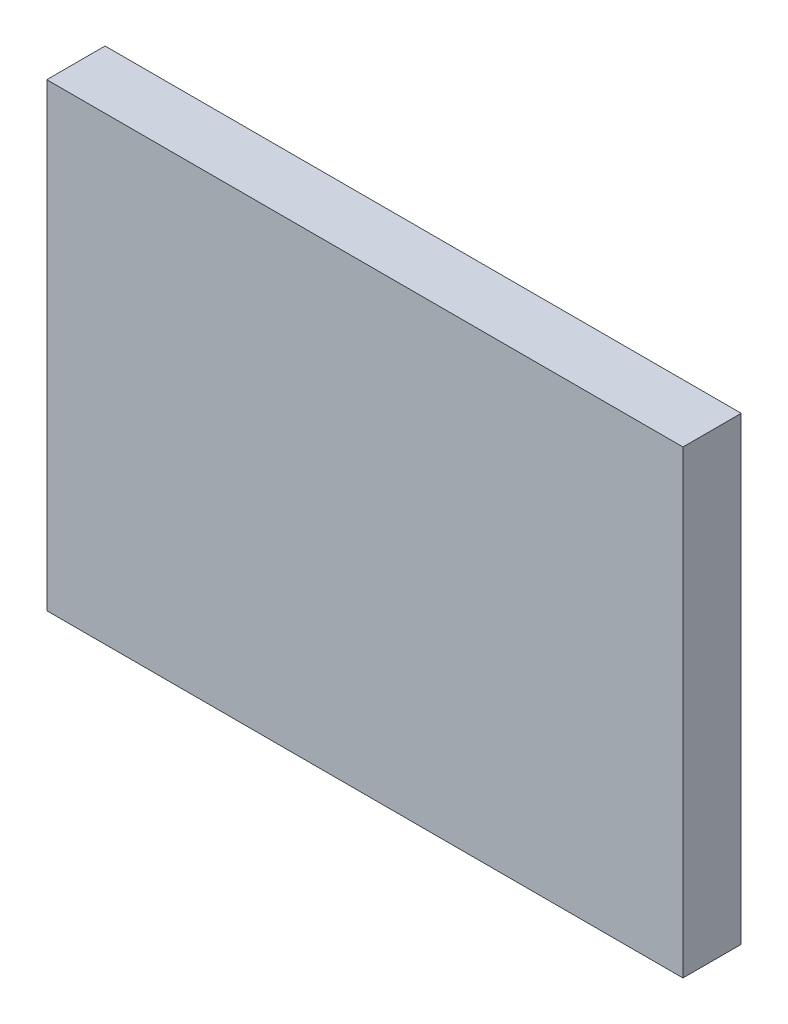
ISO-10303-21;
HEADER;
FILE_DESCRIPTION(('STEP AP214'),'2;1');
FILE_NAME('part.step','',(''),(''),'','','');
FILE_SCHEMA(('AUTOMOTIVE_DESIGN { 1 0 10303 214 1 1 1 1 }'));
ENDSEC;
DATA;
#1=APPLICATION_CONTEXT('core data for automotive mechanical design processes');
#2=APPLICATION_PROTOCOL_DEFINITION('international standard','automotive_design',2000,#1);
#3=PRODUCT_CONTEXT('',#1,'mechanical');
#4=PRODUCT('Part','Part','',(#3));
#5=PRODUCT_RELATED_PRODUCT_CATEGORY('part','',(#4));
#6=PRODUCT_DEFINITION_FORMATION('','',#4);
#7=PRODUCT_DEFINITION_CONTEXT('part definition',#1,'design');
#8=PRODUCT_DEFINITION('design','',#6,#7);
#9=PRODUCT_DEFINITION_SHAPE('','',#8);
#10=(LENGTH_UNIT() NAMED_UNIT(*) SI_UNIT(.MILLI.,.METRE.));
#11=(NAMED_UNIT(*) PLANE_ANGLE_UNIT() SI_UNIT($,.RADIAN.));
#12=(NAMED_UNIT(*) SI_UNIT($,.STERADIAN.) SOLID_ANGLE_UNIT());
#13=UNCERTAINTY_MEASURE_WITH_UNIT(LENGTH_MEASURE(1.E-05),#10,'distance_accuracy_value','');
#14=(GEOMETRIC_REPRESENTATION_CONTEXT(3) GLOBAL_UNCERTAINTY_ASSIGNED_CONTEXT((#13)) GLOBAL_UNIT_ASSIGNED_CONTEXT((#10,
#11,#12)) REPRESENTATION_CONTEXT('',''));
#15=CARTESIAN_POINT('',(0.,0.,0.));
#16=DIRECTION('',(0.,0.,1.));
#17=DIRECTION('',(1.,0.,0.));
#18=AXIS2_PLACEMENT_3D('',#15,#16,#17);
#19=CARTESIAN_POINT('',(6.912,3.888,1.));
#20=DIRECTION('',(0.,-1.,0.));
#21=DIRECTION('',(1.,0.,0.));
#22=AXIS2_PLACEMENT_3D('',#19,#20,#21);
#23=PLANE('',#22);
#24=DIRECTION('',(-1.,0.,0.));
#25=VECTOR('',#24,1.);
#26=CARTESIAN_POINT('',(6.912,3.888,0.));
#27=LINE('',#26,#25);
#28=CARTESIAN_POINT('',(6.912,3.888,0.));
#29=VERTEX_POINT('',#28);
#30=CARTESIAN_POINT('',(0.,3.888,0.));
#31=VERTEX_POINT('',#30);
#32=EDGE_CURVE('E201',#29,#31,#27,.T.);
#33=ORIENTED_EDGE('',*,*,#32,.T.);
#34=DIRECTION('',(0.,0.,-1.));
#35=VECTOR('',#34,1.);
#36=CARTESIAN_POINT('',(0.,3.888,1.));
#37=LINE('',#36,#35);
#38=CARTESIAN_POINT('',(0.,3.888,1.));
#39=VERTEX_POINT('',#38);
#40=EDGE_CURVE('E11',#39,#31,#37,.T.);
#41=ORIENTED_EDGE('',*,*,#40,.F.);
#42=DIRECTION('',(-1.,0.,0.));
#43=VECTOR('',#42,1.);
#44=CARTESIAN_POINT('',(6.912,3.888,1.));
#45=LINE('',#44,#43);
#46=CARTESIAN_POINT('',(6.912,3.888,1.));
#47=VERTEX_POINT('',#46);
#48=EDGE_CURVE('E202',#47,#39,#45,.T.);
#49=ORIENTED_EDGE('',*,*,#48,.F.);
#50=DIRECTION('',(0.,0.,-1.));
#51=VECTOR('',#50,1.);
#52=CARTESIAN_POINT('',(6.912,3.888,1.));
#53=LINE('',#52,#51);
#54=EDGE_CURVE('E212',#47,#29,#53,.T.);
#55=ORIENTED_EDGE('',*,*,#54,.T.);
#56=EDGE_LOOP('',(#33,#41,#49,#55));
#57=FACE_BOUND('',#56,.T.);
#58=ADVANCED_FACE('F36',(#57),#23,.F.);
#59=CARTESIAN_POINT('',(0.,0.,1.));
#60=DIRECTION('',(-1.,0.,0.));
#61=DIRECTION('',(0.,-1.,0.));
#62=AXIS2_PLACEMENT_3D('',#59,#60,#61);
#63=PLANE('',#62);
#64=DIRECTION('',(0.,1.,0.));
#65=VECTOR('',#64,1.);
#66=CARTESIAN_POINT('',(0.,0.,0.));
#67=LINE('',#66,#65);
#68=CARTESIAN_POINT('',(0.,0.,0.));
#69=VERTEX_POINT('',#68);
#70=EDGE_CURVE('E214',#69,#31,#67,.T.);
#71=ORIENTED_EDGE('',*,*,#70,.F.);
#72=DIRECTION('',(0.,0.,-1.));
#73=VECTOR('',#72,1.);
#74=CARTESIAN_POINT('',(0.,0.,1.));
#75=LINE('',#74,#73);
#76=CARTESIAN_POINT('',(0.,0.,1.));
#77=VERTEX_POINT('',#76);
#78=EDGE_CURVE('E43',#77,#69,#75,.T.);
#79=ORIENTED_EDGE('',*,*,#78,.F.);
#80=DIRECTION('',(0.,1.,0.));
#81=VECTOR('',#80,1.);
#82=CARTESIAN_POINT('',(0.,0.,1.));
#83=LINE('',#82,#81);
#84=EDGE_CURVE('E205',#77,#39,#83,.T.);
#85=ORIENTED_EDGE('',*,*,#84,.T.);
#86=ORIENTED_EDGE('',*,*,#40,.T.);
#87=EDGE_LOOP('',(#71,#79,#85,#86));
#88=FACE_BOUND('',#87,.T.);
#89=ADVANCED_FACE('F227',(#88),#63,.T.);
#90=CARTESIAN_POINT('',(6.912,0.,1.));
#91=DIRECTION('',(0.,-1.,0.));
#92=DIRECTION('',(0.,0.,-1.));
#93=AXIS2_PLACEMENT_3D('',#90,#91,#92);
#94=PLANE('',#93);
#95=DIRECTION('',(-1.,0.,0.));
#96=VECTOR('',#95,1.);
#97=CARTESIAN_POINT('',(6.912,0.,0.));
#98=LINE('',#97,#96);
#99=CARTESIAN_POINT('',(6.912,0.,0.));
#100=VERTEX_POINT('',#99);
#101=EDGE_CURVE('E217',#100,#69,#98,.T.);
#102=ORIENTED_EDGE('',*,*,#101,.F.);
#103=DIRECTION('',(0.,0.,-1.));
#104=VECTOR('',#103,1.);
#105=CARTESIAN_POINT('',(6.912,0.,1.));
#106=LINE('',#105,#104);
#107=CARTESIAN_POINT('',(6.912,0.,1.));
#108=VERTEX_POINT('',#107);
#109=EDGE_CURVE('E59',#108,#100,#106,.T.);
#110=ORIENTED_EDGE('',*,*,#109,.F.);
#111=DIRECTION('',(-1.,0.,0.));
#112=VECTOR('',#111,1.);
#113=CARTESIAN_POINT('',(6.912,0.,1.));
#114=LINE('',#113,#112);
#115=EDGE_CURVE('E207',#108,#77,#114,.T.);
#116=ORIENTED_EDGE('',*,*,#115,.T.);
#117=ORIENTED_EDGE('',*,*,#78,.T.);
#118=EDGE_LOOP('',(#102,#110,#116,#117));
#119=FACE_BOUND('',#118,.T.);
#120=ADVANCED_FACE('F223',(#119),#94,.T.);
#121=CARTESIAN_POINT('',(6.912,0.,1.));
#122=DIRECTION('',(-1.,0.,0.));
#123=DIRECTION('',(0.,0.,1.));
#124=AXIS2_PLACEMENT_3D('',#121,#122,#123);
#125=PLANE('',#124);
#126=DIRECTION('',(0.,1.,0.));
#127=VECTOR('',#126,1.);
#128=CARTESIAN_POINT('',(6.912,0.,0.));
#129=LINE('',#128,#127);
#130=EDGE_CURVE('E78',#100,#29,#129,.T.);
#131=ORIENTED_EDGE('',*,*,#130,.T.);
#132=ORIENTED_EDGE('',*,*,#54,.F.);
#133=DIRECTION('',(0.,1.,0.));
#134=VECTOR('',#133,1.);
#135=CARTESIAN_POINT('',(6.912,0.,1.));
#136=LINE('',#135,#134);
#137=EDGE_CURVE('E209',#108,#47,#136,.T.);
#138=ORIENTED_EDGE('',*,*,#137,.F.);
#139=ORIENTED_EDGE('',*,*,#109,.T.);
#140=EDGE_LOOP('',(#131,#132,#138,#139));
#141=FACE_BOUND('',#140,.T.);
#142=ADVANCED_FACE('F231',(#141),#125,.F.);
#143=CARTESIAN_POINT('',(0.,0.,0.));
#144=DIRECTION('',(0.,0.,-1.));
#145=DIRECTION('',(-1.,0.,0.));
#146=AXIS2_PLACEMENT_3D('',#143,#144,#145);
#147=PLANE('',#146);
#148=DIRECTION('',(-0.707106781186548,-0.707106781186547,0.));
#149=VECTOR('',#148,1.);
#150=CARTESIAN_POINT('',(3.456,2.444,0.));
#151=LINE('',#150,#149);
#152=CARTESIAN_POINT('',(3.456,2.444,0.));
#153=VERTEX_POINT('',#152);
#154=CARTESIAN_POINT('',(2.96106125524031,1.94906125524031,0.));
#155=VERTEX_POINT('',#154);
#156=EDGE_CURVE('E369',#153,#155,#151,.T.);
#157=ORIENTED_EDGE('',*,*,#156,.T.);
#158=DIRECTION('',(-0.707106781186547,0.707106781186547,0.));
#159=VECTOR('',#158,1.);
#160=CARTESIAN_POINT('',(3.46106125524031,1.44906125524031,0.));
#161=LINE('',#160,#159);
#162=CARTESIAN_POINT('',(3.46106125524031,1.44906125524031,0.));
#163=VERTEX_POINT('',#162);
#164=EDGE_CURVE('E379',#163,#155,#161,.T.);
#165=ORIENTED_EDGE('',*,*,#164,.F.);
#166=DIRECTION('',(-0.707106781186548,-0.707106781186547,0.));
#167=VECTOR('',#166,1.);
#168=CARTESIAN_POINT('',(3.956,1.944,0.));
#169=LINE('',#168,#167);
#170=CARTESIAN_POINT('',(3.956,1.944,0.));
#171=VERTEX_POINT('',#170);
#172=EDGE_CURVE('E381',#171,#163,#169,.T.);
#173=ORIENTED_EDGE('',*,*,#172,.F.);
#174=DIRECTION('',(-0.707106781186547,0.707106781186547,0.));
#175=VECTOR('',#174,1.);
#176=CARTESIAN_POINT('',(3.956,1.944,0.));
#177=LINE('',#176,#175);
#178=EDGE_CURVE('E162',#171,#153,#177,.T.);
#179=ORIENTED_EDGE('',*,*,#178,.T.);
#180=EDGE_LOOP('',(#157,#165,#173,#179));
#181=FACE_BOUND('',#180,.T.);
#182=ORIENTED_EDGE('',*,*,#32,.F.);
#183=ORIENTED_EDGE('',*,*,#130,.F.);
#184=ORIENTED_EDGE('',*,*,#101,.T.);
#185=ORIENTED_EDGE('',*,*,#70,.T.);
#186=EDGE_LOOP('',(#182,#183,#184,#185));
#187=FACE_BOUND('',#186,.T.);
#188=ADVANCED_FACE('F230',(#181,#187),#147,.T.);
#189=CARTESIAN_POINT('',(-2.,-2.,2.));
#190=DIRECTION('',(0.,1.,0.));
#191=DIRECTION('',(0.,0.,1.));
#192=AXIS2_PLACEMENT_3D('',#189,#190,#191);
#193=PLANE('',#192);
#194=DIRECTION('',(1.,0.,0.));
#195=VECTOR('',#194,1.);
#196=CARTESIAN_POINT('',(-2.,-2.,1.));
#197=LINE('',#196,#195);
#198=CARTESIAN_POINT('',(-2.,-2.,1.));
#199=VERTEX_POINT('',#198);
#200=CARTESIAN_POINT('',(8.912,-2.,1.));
#201=VERTEX_POINT('',#200);
#202=EDGE_CURVE('E166',#199,#201,#197,.T.);
#203=ORIENTED_EDGE('',*,*,#202,.T.);
#204=DIRECTION('',(0.,0.,-1.));
#205=VECTOR('',#204,1.);
#206=CARTESIAN_POINT('',(8.912,-2.,2.));
#207=LINE('',#206,#205);
#208=CARTESIAN_POINT('',(8.912,-2.,2.));
#209=VERTEX_POINT('',#208);
#210=EDGE_CURVE('E199',#209,#201,#207,.T.);
#211=ORIENTED_EDGE('',*,*,#210,.F.);
#212=DIRECTION('',(1.,0.,0.));
#213=VECTOR('',#212,1.);
#214=CARTESIAN_POINT('',(-2.,-2.,2.));
#215=LINE('',#214,#213);
#216=CARTESIAN_POINT('',(-2.,-2.,2.));
#217=VERTEX_POINT('',#216);
#218=EDGE_CURVE('E172',#217,#209,#215,.T.);
#219=ORIENTED_EDGE('',*,*,#218,.F.);
#220=DIRECTION('',(0.,0.,-1.));
#221=VECTOR('',#220,1.);
#222=CARTESIAN_POINT('',(-2.,-2.,2.));
#223=LINE('',#222,#221);
#224=EDGE_CURVE('E183',#217,#199,#223,.T.);
#225=ORIENTED_EDGE('',*,*,#224,.T.);
#226=EDGE_LOOP('',(#203,#211,#219,#225));
#227=FACE_BOUND('',#226,.T.);
#228=ADVANCED_FACE('F245',(#227),#193,.F.);
#229=CARTESIAN_POINT('',(8.912,5.888,2.));
#230=DIRECTION('',(1.,0.,0.));
#231=DIRECTION('',(0.,0.,-1.));
#232=AXIS2_PLACEMENT_3D('',#229,#230,#231);
#233=PLANE('',#232);
#234=DIRECTION('',(0.,-1.,0.));
#235=VECTOR('',#234,1.);
#236=CARTESIAN_POINT('',(8.912,5.888,1.));
#237=LINE('',#236,#235);
#238=CARTESIAN_POINT('',(8.912,5.888,1.));
#239=VERTEX_POINT('',#238);
#240=EDGE_CURVE('E186',#239,#201,#237,.T.);
#241=ORIENTED_EDGE('',*,*,#240,.F.);
#242=DIRECTION('',(0.,0.,-1.));
#243=VECTOR('',#242,1.);
#244=CARTESIAN_POINT('',(8.912,5.888,2.));
#245=LINE('',#244,#243);
#246=CARTESIAN_POINT('',(8.912,5.888,2.));
#247=VERTEX_POINT('',#246);
#248=EDGE_CURVE('E197',#247,#239,#245,.T.);
#249=ORIENTED_EDGE('',*,*,#248,.F.);
#250=DIRECTION('',(0.,-1.,0.));
#251=VECTOR('',#250,1.);
#252=CARTESIAN_POINT('',(8.912,5.888,2.));
#253=LINE('',#252,#251);
#254=EDGE_CURVE('E174',#247,#209,#253,.T.);
#255=ORIENTED_EDGE('',*,*,#254,.T.);
#256=ORIENTED_EDGE('',*,*,#210,.T.);
#257=EDGE_LOOP('',(#241,#249,#255,#256));
#258=FACE_BOUND('',#257,.T.);
#259=ADVANCED_FACE('F256',(#258),#233,.T.);
#260=CARTESIAN_POINT('',(-2.,5.888,2.));
#261=DIRECTION('',(0.,1.,0.));
#262=DIRECTION('',(0.,0.,1.));
#263=AXIS2_PLACEMENT_3D('',#260,#261,#262);
#264=PLANE('',#263);
#265=DIRECTION('',(1.,0.,0.));
#266=VECTOR('',#265,1.);
#267=CARTESIAN_POINT('',(-2.,5.888,1.));
#268=LINE('',#267,#266);
#269=CARTESIAN_POINT('',(-2.,5.888,1.));
#270=VERTEX_POINT('',#269);
#271=EDGE_CURVE('E189',#270,#239,#268,.T.);
#272=ORIENTED_EDGE('',*,*,#271,.F.);
#273=DIRECTION('',(0.,0.,-1.));
#274=VECTOR('',#273,1.);
#275=CARTESIAN_POINT('',(-2.,5.888,2.));
#276=LINE('',#275,#274);
#277=CARTESIAN_POINT('',(-2.,5.888,2.));
#278=VERTEX_POINT('',#277);
#279=EDGE_CURVE('E195',#278,#270,#276,.T.);
#280=ORIENTED_EDGE('',*,*,#279,.F.);
#281=DIRECTION('',(1.,0.,0.));
#282=VECTOR('',#281,1.);
#283=CARTESIAN_POINT('',(-2.,5.888,2.));
#284=LINE('',#283,#282);
#285=EDGE_CURVE('E178',#278,#247,#284,.T.);
#286=ORIENTED_EDGE('',*,*,#285,.T.);
#287=ORIENTED_EDGE('',*,*,#248,.T.);
#288=EDGE_LOOP('',(#272,#280,#286,#287));
#289=FACE_BOUND('',#288,.T.);
#290=ADVANCED_FACE('F253',(#289),#264,.T.);
#291=CARTESIAN_POINT('',(-2.,5.888,2.));
#292=DIRECTION('',(1.,0.,0.));
#293=DIRECTION('',(0.,1.,0.));
#294=AXIS2_PLACEMENT_3D('',#291,#292,#293);
#295=PLANE('',#294);
#296=DIRECTION('',(0.,-1.,0.));
#297=VECTOR('',#296,1.);
#298=CARTESIAN_POINT('',(-2.,5.888,1.));
#299=LINE('',#298,#297);
#300=EDGE_CURVE('E175',#270,#199,#299,.T.);
#301=ORIENTED_EDGE('',*,*,#300,.T.);
#302=ORIENTED_EDGE('',*,*,#224,.F.);
#303=DIRECTION('',(0.,-1.,0.));
#304=VECTOR('',#303,1.);
#305=CARTESIAN_POINT('',(-2.,5.888,2.));
#306=LINE('',#305,#304);
#307=EDGE_CURVE('E181',#278,#217,#306,.T.);
#308=ORIENTED_EDGE('',*,*,#307,.F.);
#309=ORIENTED_EDGE('',*,*,#279,.T.);
#310=EDGE_LOOP('',(#301,#302,#308,#309));
#311=FACE_BOUND('',#310,.T.);
#312=ADVANCED_FACE('F250',(#311),#295,.F.);
#313=CARTESIAN_POINT('',(0.,0.,2.));
#314=DIRECTION('',(0.,0.,-1.));
#315=DIRECTION('',(-1.,0.,0.));
#316=AXIS2_PLACEMENT_3D('',#313,#314,#315);
#317=PLANE('',#316);
#318=ORIENTED_EDGE('',*,*,#218,.T.);
#319=ORIENTED_EDGE('',*,*,#254,.F.);
#320=ORIENTED_EDGE('',*,*,#285,.F.);
#321=ORIENTED_EDGE('',*,*,#307,.T.);
#322=EDGE_LOOP('',(#318,#319,#320,#321));
#323=FACE_BOUND('',#322,.T.);
#324=ADVANCED_FACE('F237',(#323),#317,.F.);
#325=CARTESIAN_POINT('',(0.,0.,1.));
#326=DIRECTION('',(0.,0.,-1.));
#327=DIRECTION('',(-1.,0.,0.));
#328=AXIS2_PLACEMENT_3D('',#325,#326,#327);
#329=PLANE('',#328);
#330=ORIENTED_EDGE('',*,*,#137,.T.);
#331=ORIENTED_EDGE('',*,*,#48,.T.);
#332=ORIENTED_EDGE('',*,*,#84,.F.);
#333=ORIENTED_EDGE('',*,*,#115,.F.);
#334=EDGE_LOOP('',(#330,#331,#332,#333));
#335=FACE_BOUND('',#334,.T.);
#336=ORIENTED_EDGE('',*,*,#202,.F.);
#337=ORIENTED_EDGE('',*,*,#300,.F.);
#338=ORIENTED_EDGE('',*,*,#271,.T.);
#339=ORIENTED_EDGE('',*,*,#240,.T.);
#340=EDGE_LOOP('',(#336,#337,#338,#339));
#341=FACE_BOUND('',#340,.T.);
#342=ADVANCED_FACE('F233',(#335,#341),#329,.T.);
#343=CARTESIAN_POINT('',(3.456,2.444,-0.48));
#344=DIRECTION('',(-0.707106781186547,0.707106781186548,0.));
#345=DIRECTION('',(-0.707106781186548,-0.707106781186547,0.));
#346=AXIS2_PLACEMENT_3D('',#343,#344,#345);
#347=PLANE('',#346);
#348=DIRECTION('',(0.583157796849037,0.583157796849036,0.565556334902506));
#349=VECTOR('',#348,1.);
#350=CARTESIAN_POINT('',(3.29769187859723,2.28569187859723,-0.153529904615212));
#351=LINE('',#350,#349);
#352=CARTESIAN_POINT('',(2.96106125524031,1.94906125524031,-0.48));
#353=VERTEX_POINT('',#352);
#354=CARTESIAN_POINT('',(3.20853062762016,2.19653062762015,-0.24));
#355=VERTEX_POINT('',#354);
#356=EDGE_CURVE('E366',#353,#355,#351,.T.);
#357=ORIENTED_EDGE('',*,*,#356,.F.);
#358=DIRECTION('',(0.,0.,1.));
#359=VECTOR('',#358,1.);
#360=CARTESIAN_POINT('',(2.96106125524031,1.94906125524031,-0.48));
#361=LINE('',#360,#359);
#362=EDGE_CURVE('E151',#353,#155,#361,.T.);
#363=ORIENTED_EDGE('',*,*,#362,.T.);
#364=ORIENTED_EDGE('',*,*,#156,.F.);
#365=DIRECTION('',(0.,0.,1.));
#366=VECTOR('',#365,1.);
#367=CARTESIAN_POINT('',(3.456,2.444,-0.48));
#368=LINE('',#367,#366);
#369=CARTESIAN_POINT('',(3.456,2.444,-0.48));
#370=VERTEX_POINT('',#369);
#371=EDGE_CURVE('E164',#370,#153,#368,.T.);
#372=ORIENTED_EDGE('',*,*,#371,.F.);
#373=DIRECTION('',(0.583157796849037,0.583157796849036,-0.565556334902506));
#374=VECTOR('',#373,1.);
#375=CARTESIAN_POINT('',(3.456,2.444,-0.479999999999999));
#376=LINE('',#375,#374);
#377=EDGE_CURVE('E147',#355,#370,#376,.T.);
#378=ORIENTED_EDGE('',*,*,#377,.F.);
#379=EDGE_LOOP('',(#357,#363,#364,#372,#378));
#380=FACE_BOUND('',#379,.T.);
#381=ADVANCED_FACE('F236',(#380),#347,.T.);
#382=CARTESIAN_POINT('',(3.956,1.944,-0.48));
#383=DIRECTION('',(0.707106781186548,0.707106781186548,0.));
#384=DIRECTION('',(-0.707106781186548,0.707106781186548,0.));
#385=AXIS2_PLACEMENT_3D('',#382,#383,#384);
#386=PLANE('',#385);
#387=ORIENTED_EDGE('',*,*,#178,.F.);
#388=DIRECTION('',(0.,0.,1.));
#389=VECTOR('',#388,1.);
#390=CARTESIAN_POINT('',(3.956,1.944,-0.48));
#391=LINE('',#390,#389);
#392=CARTESIAN_POINT('',(3.956,1.944,-0.48));
#393=VERTEX_POINT('',#392);
#394=EDGE_CURVE('E156',#393,#171,#391,.T.);
#395=ORIENTED_EDGE('',*,*,#394,.F.);
#396=DIRECTION('',(-0.707106781186547,0.707106781186547,0.));
#397=VECTOR('',#396,1.);
#398=CARTESIAN_POINT('',(3.956,1.944,-0.48));
#399=LINE('',#398,#397);
#400=EDGE_CURVE('E140',#393,#370,#399,.T.);
#401=ORIENTED_EDGE('',*,*,#400,.T.);
#402=ORIENTED_EDGE('',*,*,#371,.T.);
#403=EDGE_LOOP('',(#387,#395,#401,#402));
#404=FACE_BOUND('',#403,.T.);
#405=ADVANCED_FACE('F160',(#404),#386,.T.);
#406=CARTESIAN_POINT('',(3.956,1.944,-0.48));
#407=DIRECTION('',(-0.707106781186547,0.707106781186548,0.));
#408=DIRECTION('',(-0.707106781186548,-0.707106781186547,0.));
#409=AXIS2_PLACEMENT_3D('',#406,#407,#408);
#410=PLANE('',#409);
#411=DIRECTION('',(0.,0.,1.));
#412=VECTOR('',#411,1.);
#413=CARTESIAN_POINT('',(3.46106125524031,1.44906125524031,-0.48));
#414=LINE('',#413,#412);
#415=CARTESIAN_POINT('',(3.46106125524031,1.44906125524031,-0.48));
#416=VERTEX_POINT('',#415);
#417=EDGE_CURVE('E50',#416,#163,#414,.T.);
#418=ORIENTED_EDGE('',*,*,#417,.F.);
#419=DIRECTION('',(-0.583157796849036,-0.583157796849036,-0.565556334902506));
#420=VECTOR('',#419,1.);
#421=CARTESIAN_POINT('',(3.70853062762016,1.69653062762015,-0.24));
#422=LINE('',#421,#420);
#423=CARTESIAN_POINT('',(3.70853062762016,1.69653062762015,-0.24));
#424=VERTEX_POINT('',#423);
#425=EDGE_CURVE('E158',#424,#416,#422,.T.);
#426=ORIENTED_EDGE('',*,*,#425,.F.);
#427=DIRECTION('',(-0.583157796849036,-0.583157796849036,0.565556334902506));
#428=VECTOR('',#427,1.);
#429=CARTESIAN_POINT('',(3.956,1.944,-0.48));
#430=LINE('',#429,#428);
#431=EDGE_CURVE('E144',#393,#424,#430,.T.);
#432=ORIENTED_EDGE('',*,*,#431,.F.);
#433=ORIENTED_EDGE('',*,*,#394,.T.);
#434=ORIENTED_EDGE('',*,*,#172,.T.);
#435=EDGE_LOOP('',(#418,#426,#432,#433,#434));
#436=FACE_BOUND('',#435,.T.);
#437=ADVANCED_FACE('F155',(#436),#410,.F.);
#438=CARTESIAN_POINT('',(3.46106125524031,1.44906125524031,-0.48));
#439=DIRECTION('',(0.707106781186548,0.707106781186548,0.));
#440=DIRECTION('',(-0.707106781186548,0.707106781186548,0.));
#441=AXIS2_PLACEMENT_3D('',#438,#439,#440);
#442=PLANE('',#441);
#443=ORIENTED_EDGE('',*,*,#164,.T.);
#444=ORIENTED_EDGE('',*,*,#362,.F.);
#445=DIRECTION('',(-0.707106781186547,0.707106781186547,0.));
#446=VECTOR('',#445,1.);
#447=CARTESIAN_POINT('',(3.46106125524031,1.44906125524031,-0.48));
#448=LINE('',#447,#446);
#449=EDGE_CURVE('E152',#416,#353,#448,.T.);
#450=ORIENTED_EDGE('',*,*,#449,.F.);
#451=ORIENTED_EDGE('',*,*,#417,.T.);
#452=EDGE_LOOP('',(#443,#444,#450,#451));
#453=FACE_BOUND('',#452,.T.);
#454=ADVANCED_FACE('F335',(#453),#442,.F.);
#455=CARTESIAN_POINT('',(-24.9151518748113,30.3202131300516,-0.24));
#456=DIRECTION('',(-0.399908719552573,-0.399908719552572,0.824709665307522));
#457=DIRECTION('',(0.899792910225384,0.,0.436317222566488));
#458=AXIS2_PLACEMENT_3D('',#455,#456,#457);
#459=PLANE('',#458);
#460=ORIENTED_EDGE('',*,*,#356,.T.);
#461=DIRECTION('',(0.707106781186547,-0.707106781186548,0.));
#462=VECTOR('',#461,1.);
#463=CARTESIAN_POINT('',(-24.9151518748113,30.3202131300516,-0.24));
#464=LINE('',#463,#462);
#465=EDGE_CURVE('E367',#355,#424,#464,.T.);
#466=ORIENTED_EDGE('',*,*,#465,.T.);
#467=ORIENTED_EDGE('',*,*,#425,.T.);
#468=ORIENTED_EDGE('',*,*,#449,.T.);
#469=EDGE_LOOP('',(#460,#466,#467,#468));
#470=FACE_BOUND('',#469,.T.);
#471=ADVANCED_FACE('F344',(#470),#459,.F.);
#472=CARTESIAN_POINT('',(-24.6676825024314,30.5676825024314,-0.48));
#473=DIRECTION('',(0.399908719552573,0.399908719552572,0.824709665307522));
#474=DIRECTION('',(0.899792910225384,0.,-0.436317222566488));
#475=AXIS2_PLACEMENT_3D('',#472,#473,#474);
#476=PLANE('',#475);
#477=ORIENTED_EDGE('',*,*,#377,.T.);
#478=ORIENTED_EDGE('',*,*,#400,.F.);
#479=ORIENTED_EDGE('',*,*,#431,.T.);
#480=ORIENTED_EDGE('',*,*,#465,.F.);
#481=EDGE_LOOP('',(#477,#478,#479,#480));
#482=FACE_BOUND('',#481,.T.);
#483=ADVANCED_FACE('F142',(#482),#476,.F.);
#484=CLOSED_SHELL('',(#58,#89,#120,#142,#188,#228,#259,#290,#312,#324,#342,#381,#405,#437,#454,
#471,#483));
#485=MANIFOLD_SOLID_BREP('B2',#484);
#486=ADVANCED_BREP_SHAPE_REPRESENTATION('',(#18,#485),#14);
#487=SHAPE_DEFINITION_REPRESENTATION(#9,#486);
ENDSEC;
END-ISO-10303-21;
